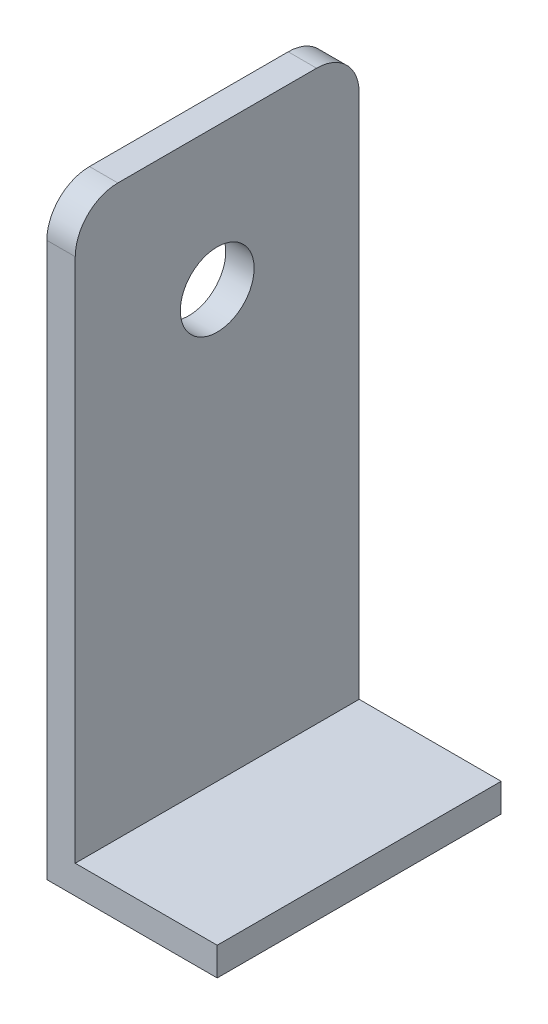
ISO-10303-21;
HEADER;
FILE_DESCRIPTION(('STEP AP214'),'2;1');
FILE_NAME('part.step','',(''),(''),'','','');
FILE_SCHEMA(('AUTOMOTIVE_DESIGN { 1 0 10303 214 1 1 1 1 }'));
ENDSEC;
DATA;
#1=APPLICATION_CONTEXT('core data for automotive mechanical design processes');
#2=APPLICATION_PROTOCOL_DEFINITION('international standard','automotive_design',2000,#1);
#3=PRODUCT_CONTEXT('',#1,'mechanical');
#4=PRODUCT('Part','Part','',(#3));
#5=PRODUCT_RELATED_PRODUCT_CATEGORY('part','',(#4));
#6=PRODUCT_DEFINITION_FORMATION('','',#4);
#7=PRODUCT_DEFINITION_CONTEXT('part definition',#1,'design');
#8=PRODUCT_DEFINITION('design','',#6,#7);
#9=PRODUCT_DEFINITION_SHAPE('','',#8);
#10=(LENGTH_UNIT() NAMED_UNIT(*) SI_UNIT(.MILLI.,.METRE.));
#11=(NAMED_UNIT(*) PLANE_ANGLE_UNIT() SI_UNIT($,.RADIAN.));
#12=(NAMED_UNIT(*) SI_UNIT($,.STERADIAN.) SOLID_ANGLE_UNIT());
#13=UNCERTAINTY_MEASURE_WITH_UNIT(LENGTH_MEASURE(1.E-05),#10,'distance_accuracy_value','');
#14=(GEOMETRIC_REPRESENTATION_CONTEXT(3) GLOBAL_UNCERTAINTY_ASSIGNED_CONTEXT((#13)) GLOBAL_UNIT_ASSIGNED_CONTEXT((#10,
#11,#12)) REPRESENTATION_CONTEXT('',''));
#15=CARTESIAN_POINT('',(0.,0.,0.));
#16=DIRECTION('',(0.,0.,1.));
#17=DIRECTION('',(1.,0.,0.));
#18=AXIS2_PLACEMENT_3D('',#15,#16,#17);
#19=CARTESIAN_POINT('',(0.,-2.,20.));
#20=DIRECTION('',(0.,1.,0.));
#21=DIRECTION('',(0.,0.,1.));
#22=AXIS2_PLACEMENT_3D('',#19,#20,#21);
#23=PLANE('',#22);
#24=DIRECTION('',(1.,0.,0.));
#25=VECTOR('',#24,1.);
#26=CARTESIAN_POINT('',(0.,-2.,0.));
#27=LINE('',#26,#25);
#28=CARTESIAN_POINT('',(-2.,-2.,0.));
#29=VERTEX_POINT('',#28);
#30=CARTESIAN_POINT('',(10.,-2.,0.));
#31=VERTEX_POINT('',#30);
#32=EDGE_CURVE('E123',#29,#31,#27,.T.);
#33=ORIENTED_EDGE('',*,*,#32,.T.);
#34=DIRECTION('',(0.,0.,-1.));
#35=VECTOR('',#34,1.);
#36=CARTESIAN_POINT('',(10.,-2.,20.));
#37=LINE('',#36,#35);
#38=CARTESIAN_POINT('',(10.,-2.,20.));
#39=VERTEX_POINT('',#38);
#40=EDGE_CURVE('E121',#39,#31,#37,.T.);
#41=ORIENTED_EDGE('',*,*,#40,.F.);
#42=DIRECTION('',(1.,0.,0.));
#43=VECTOR('',#42,1.);
#44=CARTESIAN_POINT('',(0.,-2.,20.));
#45=LINE('',#44,#43);
#46=CARTESIAN_POINT('',(-2.,-2.,20.));
#47=VERTEX_POINT('',#46);
#48=EDGE_CURVE('E106',#47,#39,#45,.T.);
#49=ORIENTED_EDGE('',*,*,#48,.F.);
#50=DIRECTION('',(0.,0.,-1.));
#51=VECTOR('',#50,1.);
#52=CARTESIAN_POINT('',(-2.,-2.,20.));
#53=LINE('',#52,#51);
#54=EDGE_CURVE('E144',#47,#29,#53,.T.);
#55=ORIENTED_EDGE('',*,*,#54,.T.);
#56=EDGE_LOOP('',(#33,#41,#49,#55));
#57=FACE_BOUND('',#56,.T.);
#58=ADVANCED_FACE('F39',(#57),#23,.F.);
#59=CARTESIAN_POINT('',(10.,0.,20.));
#60=DIRECTION('',(1.,0.,0.));
#61=DIRECTION('',(0.,0.,-1.));
#62=AXIS2_PLACEMENT_3D('',#59,#60,#61);
#63=PLANE('',#62);
#64=DIRECTION('',(0.,-1.,0.));
#65=VECTOR('',#64,1.);
#66=CARTESIAN_POINT('',(10.,0.,0.));
#67=LINE('',#66,#65);
#68=CARTESIAN_POINT('',(10.,0.,0.));
#69=VERTEX_POINT('',#68);
#70=EDGE_CURVE('E147',#69,#31,#67,.T.);
#71=ORIENTED_EDGE('',*,*,#70,.F.);
#72=DIRECTION('',(0.,0.,-1.));
#73=VECTOR('',#72,1.);
#74=CARTESIAN_POINT('',(10.,0.,20.));
#75=LINE('',#74,#73);
#76=CARTESIAN_POINT('',(10.,0.,20.));
#77=VERTEX_POINT('',#76);
#78=EDGE_CURVE('E129',#77,#69,#75,.T.);
#79=ORIENTED_EDGE('',*,*,#78,.F.);
#80=DIRECTION('',(0.,-1.,0.));
#81=VECTOR('',#80,1.);
#82=CARTESIAN_POINT('',(10.,0.,20.));
#83=LINE('',#82,#81);
#84=EDGE_CURVE('E111',#77,#39,#83,.T.);
#85=ORIENTED_EDGE('',*,*,#84,.T.);
#86=ORIENTED_EDGE('',*,*,#40,.T.);
#87=EDGE_LOOP('',(#71,#79,#85,#86));
#88=FACE_BOUND('',#87,.T.);
#89=ADVANCED_FACE('F131',(#88),#63,.T.);
#90=CARTESIAN_POINT('',(0.,0.,20.));
#91=DIRECTION('',(0.,1.,0.));
#92=DIRECTION('',(0.,0.,1.));
#93=AXIS2_PLACEMENT_3D('',#90,#91,#92);
#94=PLANE('',#93);
#95=DIRECTION('',(1.,0.,0.));
#96=VECTOR('',#95,1.);
#97=CARTESIAN_POINT('',(0.,0.,0.));
#98=LINE('',#97,#96);
#99=CARTESIAN_POINT('',(0.,0.,0.));
#100=VERTEX_POINT('',#99);
#101=EDGE_CURVE('E151',#100,#69,#98,.T.);
#102=ORIENTED_EDGE('',*,*,#101,.F.);
#103=DIRECTION('',(0.,0.,-1.));
#104=VECTOR('',#103,1.);
#105=CARTESIAN_POINT('',(0.,0.,20.));
#106=LINE('',#105,#104);
#107=CARTESIAN_POINT('',(0.,0.,20.));
#108=VERTEX_POINT('',#107);
#109=EDGE_CURVE('E169',#108,#100,#106,.T.);
#110=ORIENTED_EDGE('',*,*,#109,.F.);
#111=DIRECTION('',(1.,0.,0.));
#112=VECTOR('',#111,1.);
#113=CARTESIAN_POINT('',(0.,0.,20.));
#114=LINE('',#113,#112);
#115=EDGE_CURVE('E133',#108,#77,#114,.T.);
#116=ORIENTED_EDGE('',*,*,#115,.T.);
#117=ORIENTED_EDGE('',*,*,#78,.T.);
#118=EDGE_LOOP('',(#102,#110,#116,#117));
#119=FACE_BOUND('',#118,.T.);
#120=ADVANCED_FACE('F210',(#119),#94,.T.);
#121=CARTESIAN_POINT('',(0.,40.,20.));
#122=DIRECTION('',(1.,0.,0.));
#123=DIRECTION('',(0.,0.,-1.));
#124=AXIS2_PLACEMENT_3D('',#121,#122,#123);
#125=PLANE('',#124);
#126=CARTESIAN_POINT('',(0.,30.,10.));
#127=DIRECTION('',(1.,0.,0.));
#128=DIRECTION('',(0.,0.,-1.));
#129=AXIS2_PLACEMENT_3D('',#126,#127,#128);
#130=CIRCLE('',#129,2.6);
#131=CARTESIAN_POINT('',(0.,30.,7.4));
#132=VERTEX_POINT('',#131);
#133=EDGE_CURVE('E178',#132,#132,#130,.T.);
#134=ORIENTED_EDGE('',*,*,#133,.F.);
#135=EDGE_LOOP('',(#134));
#136=FACE_BOUND('',#135,.T.);
#137=DIRECTION('',(0.,0.,-1.));
#138=VECTOR('',#137,1.);
#139=CARTESIAN_POINT('',(0.,40.,20.));
#140=LINE('',#139,#138);
#141=CARTESIAN_POINT('',(0.,40.,17.));
#142=VERTEX_POINT('',#141);
#143=CARTESIAN_POINT('',(0.,40.,3.));
#144=VERTEX_POINT('',#143);
#145=EDGE_CURVE('E165',#142,#144,#140,.T.);
#146=ORIENTED_EDGE('',*,*,#145,.F.);
#147=CARTESIAN_POINT('',(0.,37.,17.));
#148=DIRECTION('',(1.,0.,0.));
#149=DIRECTION('',(0.,0.,-1.));
#150=AXIS2_PLACEMENT_3D('',#147,#148,#149);
#151=CIRCLE('',#150,3.);
#152=CARTESIAN_POINT('',(0.,37.,20.));
#153=VERTEX_POINT('',#152);
#154=EDGE_CURVE('E188',#142,#153,#151,.T.);
#155=ORIENTED_EDGE('',*,*,#154,.T.);
#156=DIRECTION('',(0.,-1.,0.));
#157=VECTOR('',#156,1.);
#158=CARTESIAN_POINT('',(0.,40.,20.));
#159=LINE('',#158,#157);
#160=EDGE_CURVE('E136',#153,#108,#159,.T.);
#161=ORIENTED_EDGE('',*,*,#160,.T.);
#162=ORIENTED_EDGE('',*,*,#109,.T.);
#163=DIRECTION('',(0.,-1.,0.));
#164=VECTOR('',#163,1.);
#165=CARTESIAN_POINT('',(0.,40.,0.));
#166=LINE('',#165,#164);
#167=CARTESIAN_POINT('',(0.,37.,0.));
#168=VERTEX_POINT('',#167);
#169=EDGE_CURVE('E155',#168,#100,#166,.T.);
#170=ORIENTED_EDGE('',*,*,#169,.F.);
#171=CARTESIAN_POINT('',(0.,37.,3.));
#172=DIRECTION('',(1.,0.,0.));
#173=DIRECTION('',(0.,0.,-1.));
#174=AXIS2_PLACEMENT_3D('',#171,#172,#173);
#175=CIRCLE('',#174,3.);
#176=EDGE_CURVE('E185',#168,#144,#175,.T.);
#177=ORIENTED_EDGE('',*,*,#176,.T.);
#178=EDGE_LOOP('',(#146,#155,#161,#162,#170,#177));
#179=FACE_BOUND('',#178,.T.);
#180=ADVANCED_FACE('F206',(#136,#179),#125,.T.);
#181=CARTESIAN_POINT('',(-2.,40.,20.));
#182=DIRECTION('',(0.,1.,0.));
#183=DIRECTION('',(0.,0.,1.));
#184=AXIS2_PLACEMENT_3D('',#181,#182,#183);
#185=PLANE('',#184);
#186=DIRECTION('',(0.,0.,-1.));
#187=VECTOR('',#186,1.);
#188=CARTESIAN_POINT('',(-2.,40.,20.));
#189=LINE('',#188,#187);
#190=CARTESIAN_POINT('',(-2.,40.,17.));
#191=VERTEX_POINT('',#190);
#192=CARTESIAN_POINT('',(-2.,40.,3.));
#193=VERTEX_POINT('',#192);
#194=EDGE_CURVE('E162',#191,#193,#189,.T.);
#195=ORIENTED_EDGE('',*,*,#194,.F.);
#196=DIRECTION('',(1.,0.,0.));
#197=VECTOR('',#196,1.);
#198=CARTESIAN_POINT('',(0.,40.,17.));
#199=LINE('',#198,#197);
#200=EDGE_CURVE('E181',#191,#142,#199,.T.);
#201=ORIENTED_EDGE('',*,*,#200,.T.);
#202=ORIENTED_EDGE('',*,*,#145,.T.);
#203=DIRECTION('',(1.,0.,0.));
#204=VECTOR('',#203,1.);
#205=CARTESIAN_POINT('',(-2.,40.,3.));
#206=LINE('',#205,#204);
#207=EDGE_CURVE('E128',#144,#193,#206,.F.);
#208=ORIENTED_EDGE('',*,*,#207,.T.);
#209=EDGE_LOOP('',(#195,#201,#202,#208));
#210=FACE_BOUND('',#209,.T.);
#211=ADVANCED_FACE('F201',(#210),#185,.T.);
#212=CARTESIAN_POINT('',(-2.,40.,20.));
#213=DIRECTION('',(1.,0.,0.));
#214=DIRECTION('',(0.,0.,-1.));
#215=AXIS2_PLACEMENT_3D('',#212,#213,#214);
#216=PLANE('',#215);
#217=CARTESIAN_POINT('',(-2.,30.,10.));
#218=DIRECTION('',(1.,0.,0.));
#219=DIRECTION('',(0.,0.,-1.));
#220=AXIS2_PLACEMENT_3D('',#217,#218,#219);
#221=CIRCLE('',#220,2.6);
#222=CARTESIAN_POINT('',(-2.,30.,7.4));
#223=VERTEX_POINT('',#222);
#224=EDGE_CURVE('E148',#223,#223,#221,.T.);
#225=ORIENTED_EDGE('',*,*,#224,.T.);
#226=EDGE_LOOP('',(#225));
#227=FACE_BOUND('',#226,.T.);
#228=DIRECTION('',(0.,1.,0.));
#229=VECTOR('',#228,1.);
#230=CARTESIAN_POINT('',(-2.,40.,20.));
#231=LINE('',#230,#229);
#232=CARTESIAN_POINT('',(-2.,37.,20.));
#233=VERTEX_POINT('',#232);
#234=EDGE_CURVE('E113',#233,#47,#231,.F.);
#235=ORIENTED_EDGE('',*,*,#234,.F.);
#236=CARTESIAN_POINT('',(-2.,37.,17.));
#237=DIRECTION('',(1.,0.,0.));
#238=DIRECTION('',(0.,0.,-1.));
#239=AXIS2_PLACEMENT_3D('',#236,#237,#238);
#240=CIRCLE('',#239,3.);
#241=EDGE_CURVE('E48',#233,#191,#240,.F.);
#242=ORIENTED_EDGE('',*,*,#241,.T.);
#243=ORIENTED_EDGE('',*,*,#194,.T.);
#244=CARTESIAN_POINT('',(-2.,37.,3.));
#245=DIRECTION('',(1.,0.,0.));
#246=DIRECTION('',(0.,0.,-1.));
#247=AXIS2_PLACEMENT_3D('',#244,#245,#246);
#248=CIRCLE('',#247,3.);
#249=CARTESIAN_POINT('',(-2.,37.,0.));
#250=VERTEX_POINT('',#249);
#251=EDGE_CURVE('E55',#193,#250,#248,.F.);
#252=ORIENTED_EDGE('',*,*,#251,.T.);
#253=DIRECTION('',(0.,1.,0.));
#254=VECTOR('',#253,1.);
#255=CARTESIAN_POINT('',(-2.,40.,0.));
#256=LINE('',#255,#254);
#257=EDGE_CURVE('E118',#250,#29,#256,.F.);
#258=ORIENTED_EDGE('',*,*,#257,.T.);
#259=ORIENTED_EDGE('',*,*,#54,.F.);
#260=EDGE_LOOP('',(#235,#242,#243,#252,#258,#259));
#261=FACE_BOUND('',#260,.T.);
#262=ADVANCED_FACE('F197',(#227,#261),#216,.F.);
#263=CARTESIAN_POINT('',(0.,0.,20.));
#264=DIRECTION('',(0.,0.,-1.));
#265=DIRECTION('',(-1.,0.,0.));
#266=AXIS2_PLACEMENT_3D('',#263,#264,#265);
#267=PLANE('',#266);
#268=ORIENTED_EDGE('',*,*,#160,.F.);
#269=DIRECTION('',(1.,0.,0.));
#270=VECTOR('',#269,1.);
#271=CARTESIAN_POINT('',(-2.,37.,20.));
#272=LINE('',#271,#270);
#273=EDGE_CURVE('E63',#153,#233,#272,.F.);
#274=ORIENTED_EDGE('',*,*,#273,.T.);
#275=ORIENTED_EDGE('',*,*,#234,.T.);
#276=ORIENTED_EDGE('',*,*,#48,.T.);
#277=ORIENTED_EDGE('',*,*,#84,.F.);
#278=ORIENTED_EDGE('',*,*,#115,.F.);
#279=EDGE_LOOP('',(#268,#274,#275,#276,#277,#278));
#280=FACE_BOUND('',#279,.T.);
#281=ADVANCED_FACE('F108',(#280),#267,.F.);
#282=CARTESIAN_POINT('',(0.,0.,0.));
#283=DIRECTION('',(0.,0.,-1.));
#284=DIRECTION('',(-1.,0.,0.));
#285=AXIS2_PLACEMENT_3D('',#282,#283,#284);
#286=PLANE('',#285);
#287=ORIENTED_EDGE('',*,*,#257,.F.);
#288=DIRECTION('',(1.,0.,0.));
#289=VECTOR('',#288,1.);
#290=CARTESIAN_POINT('',(0.,37.,0.));
#291=LINE('',#290,#289);
#292=EDGE_CURVE('E11',#250,#168,#291,.T.);
#293=ORIENTED_EDGE('',*,*,#292,.T.);
#294=ORIENTED_EDGE('',*,*,#169,.T.);
#295=ORIENTED_EDGE('',*,*,#101,.T.);
#296=ORIENTED_EDGE('',*,*,#70,.T.);
#297=ORIENTED_EDGE('',*,*,#32,.F.);
#298=EDGE_LOOP('',(#287,#293,#294,#295,#296,#297));
#299=FACE_BOUND('',#298,.T.);
#300=ADVANCED_FACE('F213',(#299),#286,.T.);
#301=CARTESIAN_POINT('',(-10.,30.,10.));
#302=DIRECTION('',(1.,0.,0.));
#303=DIRECTION('',(0.,0.,-1.));
#304=AXIS2_PLACEMENT_3D('',#301,#302,#303);
#305=CYLINDRICAL_SURFACE('',#304,2.6);
#306=ORIENTED_EDGE('',*,*,#133,.T.);
#307=EDGE_LOOP('',(#306));
#308=FACE_BOUND('',#307,.T.);
#309=ORIENTED_EDGE('',*,*,#224,.F.);
#310=EDGE_LOOP('',(#309));
#311=FACE_BOUND('',#310,.T.);
#312=ADVANCED_FACE('F220',(#308,#311),#305,.F.);
#313=CARTESIAN_POINT('',(-2.,37.,17.));
#314=DIRECTION('',(-1.,0.,0.));
#315=DIRECTION('',(0.,0.,1.));
#316=AXIS2_PLACEMENT_3D('',#313,#314,#315);
#317=CYLINDRICAL_SURFACE('',#316,3.);
#318=ORIENTED_EDGE('',*,*,#241,.F.);
#319=ORIENTED_EDGE('',*,*,#273,.F.);
#320=ORIENTED_EDGE('',*,*,#154,.F.);
#321=ORIENTED_EDGE('',*,*,#200,.F.);
#322=EDGE_LOOP('',(#318,#319,#320,#321));
#323=FACE_BOUND('',#322,.T.);
#324=ADVANCED_FACE('F204',(#323),#317,.T.);
#325=CARTESIAN_POINT('',(0.,37.,3.));
#326=DIRECTION('',(1.,0.,0.));
#327=DIRECTION('',(0.,0.,-1.));
#328=AXIS2_PLACEMENT_3D('',#325,#326,#327);
#329=CYLINDRICAL_SURFACE('',#328,3.);
#330=ORIENTED_EDGE('',*,*,#251,.F.);
#331=ORIENTED_EDGE('',*,*,#207,.F.);
#332=ORIENTED_EDGE('',*,*,#176,.F.);
#333=ORIENTED_EDGE('',*,*,#292,.F.);
#334=EDGE_LOOP('',(#330,#331,#332,#333));
#335=FACE_BOUND('',#334,.T.);
#336=ADVANCED_FACE('F41',(#335),#329,.T.);
#337=CLOSED_SHELL('',(#58,#89,#120,#180,#211,#262,#281,#300,#312,#324,#336));
#338=MANIFOLD_SOLID_BREP('B2',#337);
#339=ADVANCED_BREP_SHAPE_REPRESENTATION('',(#18,#338),#14);
#340=SHAPE_DEFINITION_REPRESENTATION(#9,#339);
ENDSEC;
END-ISO-10303-21;
